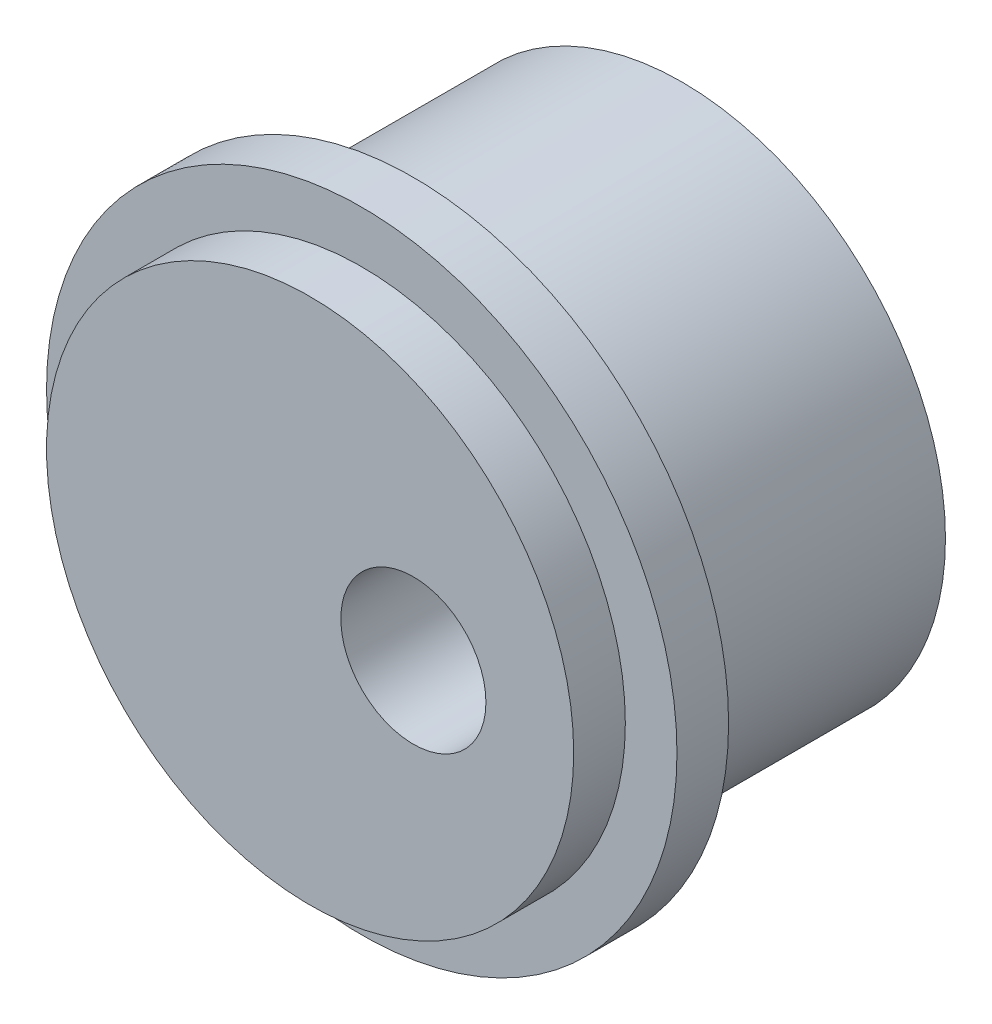
ISO-10303-21;
HEADER;
FILE_DESCRIPTION(('STEP AP214'),'2;1');
FILE_NAME('part.step','',(''),(''),'','','');
FILE_SCHEMA(('AUTOMOTIVE_DESIGN { 1 0 10303 214 1 1 1 1 }'));
ENDSEC;
DATA;
#1=APPLICATION_CONTEXT('core data for automotive mechanical design processes');
#2=APPLICATION_PROTOCOL_DEFINITION('international standard','automotive_design',2000,#1);
#3=PRODUCT_CONTEXT('',#1,'mechanical');
#4=PRODUCT('Part','Part','',(#3));
#5=PRODUCT_RELATED_PRODUCT_CATEGORY('part','',(#4));
#6=PRODUCT_DEFINITION_FORMATION('','',#4);
#7=PRODUCT_DEFINITION_CONTEXT('part definition',#1,'design');
#8=PRODUCT_DEFINITION('design','',#6,#7);
#9=PRODUCT_DEFINITION_SHAPE('','',#8);
#10=(LENGTH_UNIT() NAMED_UNIT(*) SI_UNIT(.MILLI.,.METRE.));
#11=(NAMED_UNIT(*) PLANE_ANGLE_UNIT() SI_UNIT($,.RADIAN.));
#12=(NAMED_UNIT(*) SI_UNIT($,.STERADIAN.) SOLID_ANGLE_UNIT());
#13=UNCERTAINTY_MEASURE_WITH_UNIT(LENGTH_MEASURE(1.E-05),#10,'distance_accuracy_value','');
#14=(GEOMETRIC_REPRESENTATION_CONTEXT(3) GLOBAL_UNCERTAINTY_ASSIGNED_CONTEXT((#13)) GLOBAL_UNIT_ASSIGNED_CONTEXT((#10,
#11,#12)) REPRESENTATION_CONTEXT('',''));
#15=CARTESIAN_POINT('',(0.,0.,0.));
#16=DIRECTION('',(0.,0.,1.));
#17=DIRECTION('',(1.,0.,0.));
#18=AXIS2_PLACEMENT_3D('',#15,#16,#17);
#19=CARTESIAN_POINT('',(0.,0.,-124.391204718293));
#20=DIRECTION('',(0.,0.,1.));
#21=DIRECTION('',(1.,0.,0.));
#22=AXIS2_PLACEMENT_3D('',#19,#20,#21);
#23=CYLINDRICAL_SURFACE('',#22,51.05);
#24=CARTESIAN_POINT('',(0.,0.,20.));
#25=DIRECTION('',(0.,0.,-1.));
#26=DIRECTION('',(-1.,0.,0.));
#27=AXIS2_PLACEMENT_3D('',#24,#25,#26);
#28=CIRCLE('',#27,51.05);
#29=CARTESIAN_POINT('',(-51.05,0.,20.));
#30=VERTEX_POINT('',#29);
#31=EDGE_CURVE('E272',#30,#30,#28,.F.);
#32=ORIENTED_EDGE('',*,*,#31,.T.);
#33=EDGE_LOOP('',(#32));
#34=FACE_BOUND('',#33,.T.);
#35=CARTESIAN_POINT('',(0.,0.,72.));
#36=DIRECTION('',(0.,0.,1.));
#37=DIRECTION('',(1.,0.,0.));
#38=AXIS2_PLACEMENT_3D('',#35,#36,#37);
#39=CIRCLE('',#38,51.05);
#40=CARTESIAN_POINT('',(51.05,0.,72.));
#41=VERTEX_POINT('',#40);
#42=EDGE_CURVE('E280',#41,#41,#39,.T.);
#43=ORIENTED_EDGE('',*,*,#42,.F.);
#44=EDGE_LOOP('',(#43));
#45=FACE_BOUND('',#44,.T.);
#46=ADVANCED_FACE('F36',(#34,#45),#23,.T.);
#47=CARTESIAN_POINT('',(0.,0.,20.));
#48=DIRECTION('',(0.,0.,-1.));
#49=DIRECTION('',(-1.,0.,0.));
#50=AXIS2_PLACEMENT_3D('',#47,#48,#49);
#51=PLANE('',#50);
#52=DIRECTION('',(-1.,0.,0.));
#53=VECTOR('',#52,1.);
#54=CARTESIAN_POINT('',(5.95,14.05,20.));
#55=LINE('',#54,#53);
#56=CARTESIAN_POINT('',(34.05,14.05,20.));
#57=VERTEX_POINT('',#56);
#58=CARTESIAN_POINT('',(5.95,14.05,20.));
#59=VERTEX_POINT('',#58);
#60=EDGE_CURVE('E172',#57,#59,#55,.T.);
#61=ORIENTED_EDGE('',*,*,#60,.T.);
#62=DIRECTION('',(0.,-1.,0.));
#63=VECTOR('',#62,1.);
#64=CARTESIAN_POINT('',(5.95,14.05,20.));
#65=LINE('',#64,#63);
#66=CARTESIAN_POINT('',(5.95,-14.05,20.));
#67=VERTEX_POINT('',#66);
#68=EDGE_CURVE('E59',#59,#67,#65,.T.);
#69=ORIENTED_EDGE('',*,*,#68,.T.);
#70=DIRECTION('',(1.,0.,0.));
#71=VECTOR('',#70,1.);
#72=CARTESIAN_POINT('',(5.95,-14.05,20.));
#73=LINE('',#72,#71);
#74=CARTESIAN_POINT('',(34.05,-14.05,20.));
#75=VERTEX_POINT('',#74);
#76=EDGE_CURVE('E166',#67,#75,#73,.T.);
#77=ORIENTED_EDGE('',*,*,#76,.T.);
#78=DIRECTION('',(0.,1.,0.));
#79=VECTOR('',#78,1.);
#80=CARTESIAN_POINT('',(34.05,14.05,20.));
#81=LINE('',#80,#79);
#82=EDGE_CURVE('E169',#75,#57,#81,.T.);
#83=ORIENTED_EDGE('',*,*,#82,.T.);
#84=EDGE_LOOP('',(#61,#69,#77,#83));
#85=FACE_BOUND('',#84,.T.);
#86=ORIENTED_EDGE('',*,*,#31,.F.);
#87=EDGE_LOOP('',(#86));
#88=FACE_BOUND('',#87,.T.);
#89=ADVANCED_FACE('F38',(#85,#88),#51,.T.);
#90=CARTESIAN_POINT('',(0.,0.,92.));
#91=DIRECTION('',(0.,0.,1.));
#92=DIRECTION('',(1.,0.,0.));
#93=AXIS2_PLACEMENT_3D('',#90,#91,#92);
#94=PLANE('',#93);
#95=CARTESIAN_POINT('',(20.,0.,92.));
#96=DIRECTION('',(0.,0.,1.));
#97=DIRECTION('',(1.,0.,0.));
#98=AXIS2_PLACEMENT_3D('',#95,#96,#97);
#99=CIRCLE('',#98,14.05);
#100=CARTESIAN_POINT('',(34.05,0.,92.));
#101=VERTEX_POINT('',#100);
#102=EDGE_CURVE('E194',#101,#101,#99,.T.);
#103=ORIENTED_EDGE('',*,*,#102,.F.);
#104=EDGE_LOOP('',(#103));
#105=FACE_BOUND('',#104,.T.);
#106=CARTESIAN_POINT('',(0.,0.,92.));
#107=DIRECTION('',(0.,0.,1.));
#108=DIRECTION('',(1.,0.,0.));
#109=AXIS2_PLACEMENT_3D('',#106,#107,#108);
#110=CIRCLE('',#109,51.05);
#111=CARTESIAN_POINT('',(51.05,0.,92.));
#112=VERTEX_POINT('',#111);
#113=EDGE_CURVE('E122',#112,#112,#110,.T.);
#114=ORIENTED_EDGE('',*,*,#113,.T.);
#115=EDGE_LOOP('',(#114));
#116=FACE_BOUND('',#115,.T.);
#117=ADVANCED_FACE('F253',(#105,#116),#94,.T.);
#118=CARTESIAN_POINT('',(12.5,-21.051,32.5));
#119=DIRECTION('',(0.,0.,1.));
#120=DIRECTION('',(1.,0.,0.));
#121=AXIS2_PLACEMENT_3D('',#118,#119,#120);
#122=PLANE('',#121);
#123=CARTESIAN_POINT('',(20.,0.,32.5));
#124=DIRECTION('',(0.,0.,1.));
#125=DIRECTION('',(1.,0.,0.));
#126=AXIS2_PLACEMENT_3D('',#123,#124,#125);
#127=CIRCLE('',#126,21.05);
#128=CARTESIAN_POINT('',(12.5,19.6685662924373,32.5));
#129=VERTEX_POINT('',#128);
#130=CARTESIAN_POINT('',(27.5,19.6685662924373,32.5));
#131=VERTEX_POINT('',#130);
#132=EDGE_CURVE('E120',#129,#131,#127,.F.);
#133=ORIENTED_EDGE('',*,*,#132,.T.);
#134=DIRECTION('',(0.,1.,0.));
#135=VECTOR('',#134,1.);
#136=CARTESIAN_POINT('',(27.5,-21.051,32.5));
#137=LINE('',#136,#135);
#138=CARTESIAN_POINT('',(27.5,14.05,32.5));
#139=VERTEX_POINT('',#138);
#140=EDGE_CURVE('E140',#139,#131,#137,.T.);
#141=ORIENTED_EDGE('',*,*,#140,.F.);
#142=DIRECTION('',(1.,0.,0.));
#143=VECTOR('',#142,1.);
#144=CARTESIAN_POINT('',(12.5,14.05,32.5));
#145=LINE('',#144,#143);
#146=CARTESIAN_POINT('',(12.5,14.05,32.5));
#147=VERTEX_POINT('',#146);
#148=EDGE_CURVE('E136',#147,#139,#145,.T.);
#149=ORIENTED_EDGE('',*,*,#148,.F.);
#150=DIRECTION('',(0.,1.,0.));
#151=VECTOR('',#150,1.);
#152=CARTESIAN_POINT('',(12.5,-21.051,32.5));
#153=LINE('',#152,#151);
#154=EDGE_CURVE('E51',#147,#129,#153,.T.);
#155=ORIENTED_EDGE('',*,*,#154,.T.);
#156=EDGE_LOOP('',(#133,#141,#149,#155));
#157=FACE_BOUND('',#156,.T.);
#158=ADVANCED_FACE('F186',(#157),#122,.F.);
#159=CARTESIAN_POINT('',(12.5,-21.051,22.5));
#160=DIRECTION('',(0.,0.,-1.));
#161=DIRECTION('',(-1.,0.,0.));
#162=AXIS2_PLACEMENT_3D('',#159,#160,#161);
#163=PLANE('',#162);
#164=DIRECTION('',(0.,1.,0.));
#165=VECTOR('',#164,1.);
#166=CARTESIAN_POINT('',(27.5,-21.051,22.5));
#167=LINE('',#166,#165);
#168=CARTESIAN_POINT('',(27.5,14.05,22.5));
#169=VERTEX_POINT('',#168);
#170=CARTESIAN_POINT('',(27.5,19.6685662924373,22.5));
#171=VERTEX_POINT('',#170);
#172=EDGE_CURVE('E131',#169,#171,#167,.T.);
#173=ORIENTED_EDGE('',*,*,#172,.T.);
#174=CARTESIAN_POINT('',(20.,0.,22.5));
#175=DIRECTION('',(0.,0.,-1.));
#176=DIRECTION('',(-1.,0.,0.));
#177=AXIS2_PLACEMENT_3D('',#174,#175,#176);
#178=CIRCLE('',#177,21.05);
#179=CARTESIAN_POINT('',(12.4999999999999,19.6685662924373,22.5));
#180=VERTEX_POINT('',#179);
#181=EDGE_CURVE('E117',#171,#180,#178,.F.);
#182=ORIENTED_EDGE('',*,*,#181,.T.);
#183=DIRECTION('',(0.,1.,0.));
#184=VECTOR('',#183,1.);
#185=CARTESIAN_POINT('',(12.5,-21.051,22.5));
#186=LINE('',#185,#184);
#187=CARTESIAN_POINT('',(12.5,14.05,22.5));
#188=VERTEX_POINT('',#187);
#189=EDGE_CURVE('E128',#188,#180,#186,.T.);
#190=ORIENTED_EDGE('',*,*,#189,.F.);
#191=DIRECTION('',(-1.,0.,0.));
#192=VECTOR('',#191,1.);
#193=CARTESIAN_POINT('',(12.5,14.05,22.5));
#194=LINE('',#193,#192);
#195=EDGE_CURVE('E200',#169,#188,#194,.T.);
#196=ORIENTED_EDGE('',*,*,#195,.F.);
#197=EDGE_LOOP('',(#173,#182,#190,#196));
#198=FACE_BOUND('',#197,.T.);
#199=ADVANCED_FACE('F127',(#198),#163,.F.);
#200=CARTESIAN_POINT('',(5.95,14.05,52.));
#201=DIRECTION('',(1.,0.,0.));
#202=DIRECTION('',(0.,1.,0.));
#203=AXIS2_PLACEMENT_3D('',#200,#201,#202);
#204=PLANE('',#203);
#205=ORIENTED_EDGE('',*,*,#68,.F.);
#206=DIRECTION('',(0.,0.,-1.));
#207=VECTOR('',#206,1.);
#208=CARTESIAN_POINT('',(5.95,14.05,52.));
#209=LINE('',#208,#207);
#210=CARTESIAN_POINT('',(5.95,14.05,52.));
#211=VERTEX_POINT('',#210);
#212=EDGE_CURVE('E164',#211,#59,#209,.T.);
#213=ORIENTED_EDGE('',*,*,#212,.F.);
#214=DIRECTION('',(0.,-1.,0.));
#215=VECTOR('',#214,1.);
#216=CARTESIAN_POINT('',(5.95,14.05,52.));
#217=LINE('',#216,#215);
#218=CARTESIAN_POINT('',(5.94999999999999,0.,52.));
#219=VERTEX_POINT('',#218);
#220=EDGE_CURVE('E148',#211,#219,#217,.T.);
#221=ORIENTED_EDGE('',*,*,#220,.T.);
#222=CARTESIAN_POINT('',(5.95,-14.05,52.));
#223=VERTEX_POINT('',#222);
#224=EDGE_CURVE('E152',#219,#223,#217,.T.);
#225=ORIENTED_EDGE('',*,*,#224,.T.);
#226=DIRECTION('',(0.,0.,-1.));
#227=VECTOR('',#226,1.);
#228=CARTESIAN_POINT('',(5.95,-14.05,52.));
#229=LINE('',#228,#227);
#230=EDGE_CURVE('E180',#223,#67,#229,.T.);
#231=ORIENTED_EDGE('',*,*,#230,.T.);
#232=EDGE_LOOP('',(#205,#213,#221,#225,#231));
#233=FACE_BOUND('',#232,.T.);
#234=ADVANCED_FACE('F236',(#233),#204,.T.);
#235=CARTESIAN_POINT('',(5.95,-14.05,52.));
#236=DIRECTION('',(0.,1.,0.));
#237=DIRECTION('',(0.,0.,1.));
#238=AXIS2_PLACEMENT_3D('',#235,#236,#237);
#239=PLANE('',#238);
#240=ORIENTED_EDGE('',*,*,#76,.F.);
#241=ORIENTED_EDGE('',*,*,#230,.F.);
#242=DIRECTION('',(1.,0.,0.));
#243=VECTOR('',#242,1.);
#244=CARTESIAN_POINT('',(5.95,-14.05,52.));
#245=LINE('',#244,#243);
#246=CARTESIAN_POINT('',(20.,-14.05,52.));
#247=VERTEX_POINT('',#246);
#248=EDGE_CURVE('E153',#223,#247,#245,.T.);
#249=ORIENTED_EDGE('',*,*,#248,.T.);
#250=CARTESIAN_POINT('',(34.05,-14.05,52.));
#251=VERTEX_POINT('',#250);
#252=EDGE_CURVE('E151',#247,#251,#245,.T.);
#253=ORIENTED_EDGE('',*,*,#252,.T.);
#254=DIRECTION('',(0.,0.,-1.));
#255=VECTOR('',#254,1.);
#256=CARTESIAN_POINT('',(34.05,-14.05,52.));
#257=LINE('',#256,#255);
#258=EDGE_CURVE('E178',#251,#75,#257,.T.);
#259=ORIENTED_EDGE('',*,*,#258,.T.);
#260=EDGE_LOOP('',(#240,#241,#249,#253,#259));
#261=FACE_BOUND('',#260,.T.);
#262=ADVANCED_FACE('F235',(#261),#239,.T.);
#263=CARTESIAN_POINT('',(34.05,14.05,52.));
#264=DIRECTION('',(-1.,0.,0.));
#265=DIRECTION('',(0.,0.,1.));
#266=AXIS2_PLACEMENT_3D('',#263,#264,#265);
#267=PLANE('',#266);
#268=ORIENTED_EDGE('',*,*,#82,.F.);
#269=ORIENTED_EDGE('',*,*,#258,.F.);
#270=DIRECTION('',(0.,1.,0.));
#271=VECTOR('',#270,1.);
#272=CARTESIAN_POINT('',(34.05,14.05,52.));
#273=LINE('',#272,#271);
#274=CARTESIAN_POINT('',(34.05,0.,52.));
#275=VERTEX_POINT('',#274);
#276=EDGE_CURVE('E157',#251,#275,#273,.T.);
#277=ORIENTED_EDGE('',*,*,#276,.T.);
#278=CARTESIAN_POINT('',(34.05,14.05,52.));
#279=VERTEX_POINT('',#278);
#280=EDGE_CURVE('E156',#275,#279,#273,.T.);
#281=ORIENTED_EDGE('',*,*,#280,.T.);
#282=DIRECTION('',(0.,0.,-1.));
#283=VECTOR('',#282,1.);
#284=CARTESIAN_POINT('',(34.05,14.05,52.));
#285=LINE('',#284,#283);
#286=EDGE_CURVE('E176',#279,#57,#285,.T.);
#287=ORIENTED_EDGE('',*,*,#286,.T.);
#288=EDGE_LOOP('',(#268,#269,#277,#281,#287));
#289=FACE_BOUND('',#288,.T.);
#290=ADVANCED_FACE('F205',(#289),#267,.T.);
#291=CARTESIAN_POINT('',(5.95,14.05,52.));
#292=DIRECTION('',(0.,-1.,0.));
#293=DIRECTION('',(0.,0.,-1.));
#294=AXIS2_PLACEMENT_3D('',#291,#292,#293);
#295=PLANE('',#294);
#296=ORIENTED_EDGE('',*,*,#148,.T.);
#297=DIRECTION('',(0.,0.,-1.));
#298=VECTOR('',#297,1.);
#299=CARTESIAN_POINT('',(27.5,14.05,22.5));
#300=LINE('',#299,#298);
#301=EDGE_CURVE('E196',#139,#169,#300,.T.);
#302=ORIENTED_EDGE('',*,*,#301,.T.);
#303=ORIENTED_EDGE('',*,*,#195,.T.);
#304=DIRECTION('',(0.,0.,1.));
#305=VECTOR('',#304,1.);
#306=CARTESIAN_POINT('',(12.5,14.05,22.5));
#307=LINE('',#306,#305);
#308=EDGE_CURVE('E135',#188,#147,#307,.T.);
#309=ORIENTED_EDGE('',*,*,#308,.T.);
#310=EDGE_LOOP('',(#296,#302,#303,#309));
#311=FACE_BOUND('',#310,.T.);
#312=ORIENTED_EDGE('',*,*,#60,.F.);
#313=ORIENTED_EDGE('',*,*,#286,.F.);
#314=DIRECTION('',(-1.,0.,0.));
#315=VECTOR('',#314,1.);
#316=CARTESIAN_POINT('',(5.95,14.05,52.));
#317=LINE('',#316,#315);
#318=CARTESIAN_POINT('',(20.,14.05,52.));
#319=VERTEX_POINT('',#318);
#320=EDGE_CURVE('E161',#279,#319,#317,.T.);
#321=ORIENTED_EDGE('',*,*,#320,.T.);
#322=EDGE_CURVE('E160',#319,#211,#317,.T.);
#323=ORIENTED_EDGE('',*,*,#322,.T.);
#324=ORIENTED_EDGE('',*,*,#212,.T.);
#325=EDGE_LOOP('',(#312,#313,#321,#323,#324));
#326=FACE_BOUND('',#325,.T.);
#327=ADVANCED_FACE('F202',(#311,#326),#295,.T.);
#328=CARTESIAN_POINT('',(27.5,-21.051,22.5));
#329=DIRECTION('',(1.,0.,0.));
#330=DIRECTION('',(0.,0.,-1.));
#331=AXIS2_PLACEMENT_3D('',#328,#329,#330);
#332=PLANE('',#331);
#333=ORIENTED_EDGE('',*,*,#140,.T.);
#334=DIRECTION('',(0.,0.,1.));
#335=VECTOR('',#334,1.);
#336=CARTESIAN_POINT('',(27.5,19.6685662924373,-9.76919548795381));
#337=LINE('',#336,#335);
#338=EDGE_CURVE('E44',#131,#171,#337,.F.);
#339=ORIENTED_EDGE('',*,*,#338,.T.);
#340=ORIENTED_EDGE('',*,*,#172,.F.);
#341=ORIENTED_EDGE('',*,*,#301,.F.);
#342=EDGE_LOOP('',(#333,#339,#340,#341));
#343=FACE_BOUND('',#342,.T.);
#344=ADVANCED_FACE('F182',(#343),#332,.F.);
#345=CARTESIAN_POINT('',(12.5,-21.051,22.5));
#346=DIRECTION('',(-1.,0.,0.));
#347=DIRECTION('',(0.,0.,1.));
#348=AXIS2_PLACEMENT_3D('',#345,#346,#347);
#349=PLANE('',#348);
#350=ORIENTED_EDGE('',*,*,#189,.T.);
#351=DIRECTION('',(0.,0.,1.));
#352=VECTOR('',#351,1.);
#353=CARTESIAN_POINT('',(12.5,19.6685662924373,-9.76919548795364));
#354=LINE('',#353,#352);
#355=EDGE_CURVE('E114',#180,#129,#354,.T.);
#356=ORIENTED_EDGE('',*,*,#355,.T.);
#357=ORIENTED_EDGE('',*,*,#154,.F.);
#358=ORIENTED_EDGE('',*,*,#308,.F.);
#359=EDGE_LOOP('',(#350,#356,#357,#358));
#360=FACE_BOUND('',#359,.T.);
#361=ADVANCED_FACE('F133',(#360),#349,.F.);
#362=CARTESIAN_POINT('',(0.,0.,52.));
#363=DIRECTION('',(0.,0.,1.));
#364=DIRECTION('',(1.,0.,0.));
#365=AXIS2_PLACEMENT_3D('',#362,#363,#364);
#366=PLANE('',#365);
#367=ORIENTED_EDGE('',*,*,#320,.F.);
#368=ORIENTED_EDGE('',*,*,#280,.F.);
#369=CARTESIAN_POINT('',(20.,0.,52.));
#370=DIRECTION('',(0.,0.,1.));
#371=DIRECTION('',(1.,0.,0.));
#372=AXIS2_PLACEMENT_3D('',#369,#370,#371);
#373=CIRCLE('',#372,14.05);
#374=EDGE_CURVE('E192',#275,#319,#373,.T.);
#375=ORIENTED_EDGE('',*,*,#374,.T.);
#376=EDGE_LOOP('',(#367,#368,#375));
#377=FACE_BOUND('',#376,.T.);
#378=ADVANCED_FACE('F217',(#377),#366,.F.);
#379=ORIENTED_EDGE('',*,*,#322,.F.);
#380=EDGE_CURVE('E199',#319,#219,#373,.T.);
#381=ORIENTED_EDGE('',*,*,#380,.T.);
#382=ORIENTED_EDGE('',*,*,#220,.F.);
#383=EDGE_LOOP('',(#379,#381,#382));
#384=FACE_BOUND('',#383,.T.);
#385=ADVANCED_FACE('F237',(#384),#366,.F.);
#386=ORIENTED_EDGE('',*,*,#224,.F.);
#387=EDGE_CURVE('E190',#219,#247,#373,.T.);
#388=ORIENTED_EDGE('',*,*,#387,.T.);
#389=ORIENTED_EDGE('',*,*,#248,.F.);
#390=EDGE_LOOP('',(#386,#388,#389));
#391=FACE_BOUND('',#390,.T.);
#392=ADVANCED_FACE('F231',(#391),#366,.F.);
#393=ORIENTED_EDGE('',*,*,#276,.F.);
#394=ORIENTED_EDGE('',*,*,#252,.F.);
#395=EDGE_CURVE('E187',#247,#275,#373,.T.);
#396=ORIENTED_EDGE('',*,*,#395,.T.);
#397=EDGE_LOOP('',(#393,#394,#396));
#398=FACE_BOUND('',#397,.T.);
#399=ADVANCED_FACE('F221',(#398),#366,.F.);
#400=CARTESIAN_POINT('',(20.,0.,92.));
#401=DIRECTION('',(0.,0.,-1.));
#402=DIRECTION('',(-1.,0.,0.));
#403=AXIS2_PLACEMENT_3D('',#400,#401,#402);
#404=CYLINDRICAL_SURFACE('',#403,14.05);
#405=ORIENTED_EDGE('',*,*,#102,.T.);
#406=EDGE_LOOP('',(#405));
#407=FACE_BOUND('',#406,.T.);
#408=ORIENTED_EDGE('',*,*,#374,.F.);
#409=ORIENTED_EDGE('',*,*,#395,.F.);
#410=ORIENTED_EDGE('',*,*,#387,.F.);
#411=ORIENTED_EDGE('',*,*,#380,.F.);
#412=EDGE_LOOP('',(#408,#409,#410,#411));
#413=FACE_BOUND('',#412,.T.);
#414=ADVANCED_FACE('F227',(#407,#413),#404,.F.);
#415=CARTESIAN_POINT('',(0.,0.,82.));
#416=DIRECTION('',(0.,0.,1.));
#417=DIRECTION('',(1.,0.,0.));
#418=AXIS2_PLACEMENT_3D('',#415,#416,#417);
#419=CIRCLE('',#418,51.05);
#420=CARTESIAN_POINT('',(51.05,0.,82.));
#421=VERTEX_POINT('',#420);
#422=EDGE_CURVE('E11',#421,#421,#419,.F.);
#423=ORIENTED_EDGE('',*,*,#422,.F.);
#424=EDGE_LOOP('',(#423));
#425=FACE_BOUND('',#424,.T.);
#426=ORIENTED_EDGE('',*,*,#113,.F.);
#427=EDGE_LOOP('',(#426));
#428=FACE_BOUND('',#427,.T.);
#429=ADVANCED_FACE('F249',(#425,#428),#23,.T.);
#430=CARTESIAN_POINT('',(20.,0.,-124.391204718293));
#431=DIRECTION('',(0.,0.,1.));
#432=DIRECTION('',(1.,0.,0.));
#433=AXIS2_PLACEMENT_3D('',#430,#431,#432);
#434=CYLINDRICAL_SURFACE('',#433,21.05);
#435=ORIENTED_EDGE('',*,*,#181,.F.);
#436=ORIENTED_EDGE('',*,*,#338,.F.);
#437=ORIENTED_EDGE('',*,*,#132,.F.);
#438=ORIENTED_EDGE('',*,*,#355,.F.);
#439=EDGE_LOOP('',(#435,#436,#437,#438));
#440=FACE_BOUND('',#439,.T.);
#441=ADVANCED_FACE('F116',(#440),#434,.F.);
#442=CARTESIAN_POINT('',(0.,0.,72.));
#443=DIRECTION('',(0.,0.,1.));
#444=DIRECTION('',(1.,0.,0.));
#445=AXIS2_PLACEMENT_3D('',#442,#443,#444);
#446=CYLINDRICAL_SURFACE('',#445,61.05);
#447=CARTESIAN_POINT('',(0.,0.,72.));
#448=DIRECTION('',(0.,0.,1.));
#449=DIRECTION('',(1.,0.,0.));
#450=AXIS2_PLACEMENT_3D('',#447,#448,#449);
#451=CIRCLE('',#450,61.05);
#452=CARTESIAN_POINT('',(61.05,0.,72.));
#453=VERTEX_POINT('',#452);
#454=EDGE_CURVE('E274',#453,#453,#451,.T.);
#455=ORIENTED_EDGE('',*,*,#454,.T.);
#456=EDGE_LOOP('',(#455));
#457=FACE_BOUND('',#456,.T.);
#458=CARTESIAN_POINT('',(0.,0.,82.));
#459=DIRECTION('',(0.,0.,1.));
#460=DIRECTION('',(1.,0.,0.));
#461=AXIS2_PLACEMENT_3D('',#458,#459,#460);
#462=CIRCLE('',#461,61.05);
#463=CARTESIAN_POINT('',(61.05,0.,82.));
#464=VERTEX_POINT('',#463);
#465=EDGE_CURVE('E277',#464,#464,#462,.T.);
#466=ORIENTED_EDGE('',*,*,#465,.F.);
#467=EDGE_LOOP('',(#466));
#468=FACE_BOUND('',#467,.T.);
#469=ADVANCED_FACE('F264',(#457,#468),#446,.T.);
#470=CARTESIAN_POINT('',(0.,0.,72.));
#471=DIRECTION('',(0.,0.,1.));
#472=DIRECTION('',(1.,0.,0.));
#473=AXIS2_PLACEMENT_3D('',#470,#471,#472);
#474=PLANE('',#473);
#475=ORIENTED_EDGE('',*,*,#42,.T.);
#476=EDGE_LOOP('',(#475));
#477=FACE_BOUND('',#476,.T.);
#478=ORIENTED_EDGE('',*,*,#454,.F.);
#479=EDGE_LOOP('',(#478));
#480=FACE_BOUND('',#479,.T.);
#481=ADVANCED_FACE('F286',(#477,#480),#474,.F.);
#482=CARTESIAN_POINT('',(0.,0.,82.));
#483=DIRECTION('',(0.,0.,1.));
#484=DIRECTION('',(1.,0.,0.));
#485=AXIS2_PLACEMENT_3D('',#482,#483,#484);
#486=PLANE('',#485);
#487=ORIENTED_EDGE('',*,*,#422,.T.);
#488=EDGE_LOOP('',(#487));
#489=FACE_BOUND('',#488,.T.);
#490=ORIENTED_EDGE('',*,*,#465,.T.);
#491=EDGE_LOOP('',(#490));
#492=FACE_BOUND('',#491,.T.);
#493=ADVANCED_FACE('F289',(#489,#492),#486,.T.);
#494=CLOSED_SHELL('',(#46,#89,#117,#158,#199,#234,#262,#290,#327,#344,#361,#378,#385,#392,#399,
#414,#429,#441,#469,#481,#493));
#495=MANIFOLD_SOLID_BREP('B2',#494);
#496=ADVANCED_BREP_SHAPE_REPRESENTATION('',(#18,#495),#14);
#497=SHAPE_DEFINITION_REPRESENTATION(#9,#496);
ENDSEC;
END-ISO-10303-21;
